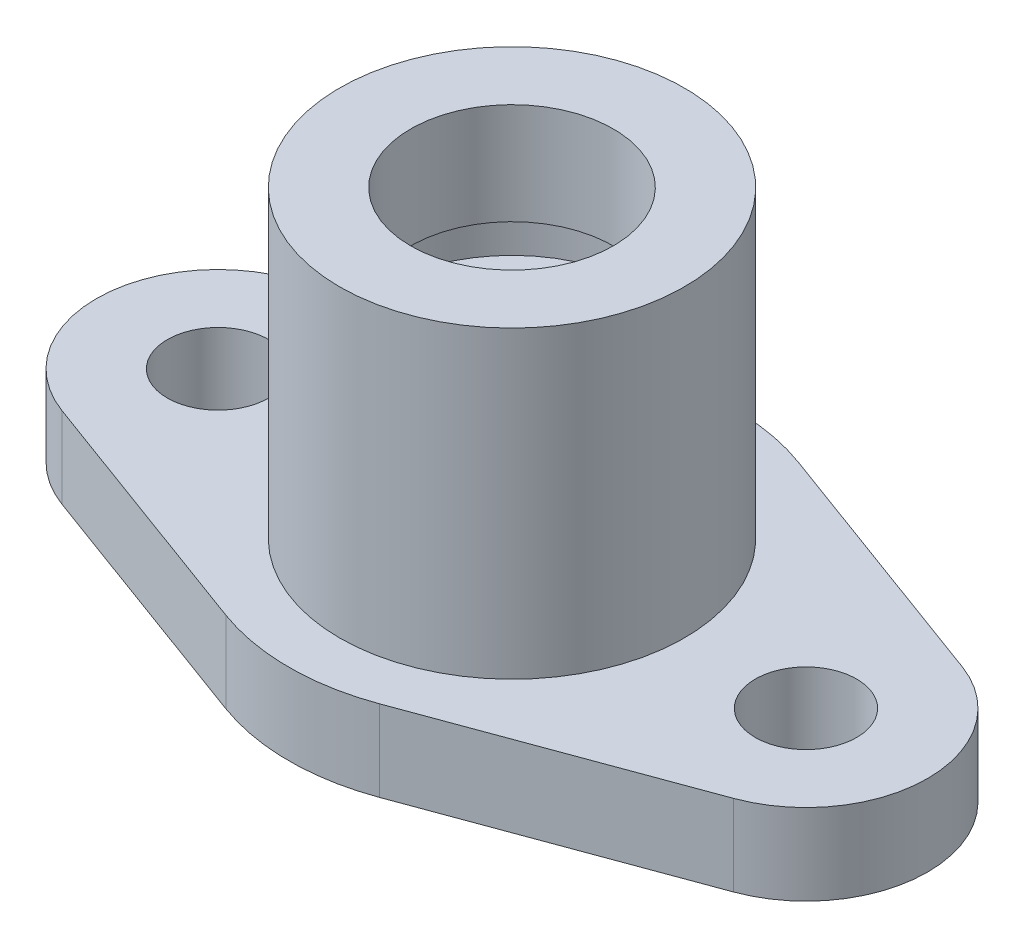
ISO-10303-21;
HEADER;
FILE_DESCRIPTION(('STEP AP214'),'2;1');
FILE_NAME('part.step','',(''),(''),'','','');
FILE_SCHEMA(('AUTOMOTIVE_DESIGN { 1 0 10303 214 1 1 1 1 }'));
ENDSEC;
DATA;
#1=APPLICATION_CONTEXT('core data for automotive mechanical design processes');
#2=APPLICATION_PROTOCOL_DEFINITION('international standard','automotive_design',2000,#1);
#3=PRODUCT_CONTEXT('',#1,'mechanical');
#4=PRODUCT('Part','Part','',(#3));
#5=PRODUCT_RELATED_PRODUCT_CATEGORY('part','',(#4));
#6=PRODUCT_DEFINITION_FORMATION('','',#4);
#7=PRODUCT_DEFINITION_CONTEXT('part definition',#1,'design');
#8=PRODUCT_DEFINITION('design','',#6,#7);
#9=PRODUCT_DEFINITION_SHAPE('','',#8);
#10=(LENGTH_UNIT() NAMED_UNIT(*) SI_UNIT(.MILLI.,.METRE.));
#11=(NAMED_UNIT(*) PLANE_ANGLE_UNIT() SI_UNIT($,.RADIAN.));
#12=(NAMED_UNIT(*) SI_UNIT($,.STERADIAN.) SOLID_ANGLE_UNIT());
#13=UNCERTAINTY_MEASURE_WITH_UNIT(LENGTH_MEASURE(1.E-05),#10,'distance_accuracy_value','');
#14=(GEOMETRIC_REPRESENTATION_CONTEXT(3) GLOBAL_UNCERTAINTY_ASSIGNED_CONTEXT((#13)) GLOBAL_UNIT_ASSIGNED_CONTEXT((#10,
#11,#12)) REPRESENTATION_CONTEXT('',''));
#15=CARTESIAN_POINT('',(0.,0.,0.));
#16=DIRECTION('',(0.,0.,1.));
#17=DIRECTION('',(1.,0.,0.));
#18=AXIS2_PLACEMENT_3D('',#15,#16,#17);
#19=CARTESIAN_POINT('',(0.,8.,0.));
#20=DIRECTION('',(0.,-1.,0.));
#21=DIRECTION('',(0.,0.,-1.));
#22=AXIS2_PLACEMENT_3D('',#19,#20,#21);
#23=CYLINDRICAL_SURFACE('',#22,10.);
#24=CARTESIAN_POINT('',(0.,23.,0.));
#25=DIRECTION('',(0.,-1.,0.));
#26=DIRECTION('',(0.,0.,-1.));
#27=AXIS2_PLACEMENT_3D('',#24,#25,#26);
#28=CIRCLE('',#27,10.);
#29=CARTESIAN_POINT('',(0.,23.,-10.));
#30=VERTEX_POINT('',#29);
#31=EDGE_CURVE('E34',#30,#30,#28,.T.);
#32=ORIENTED_EDGE('',*,*,#31,.F.);
#33=EDGE_LOOP('',(#32));
#34=FACE_BOUND('',#33,.T.);
#35=CARTESIAN_POINT('',(0.,0.,0.));
#36=DIRECTION('',(0.,1.,0.));
#37=DIRECTION('',(0.,0.,1.));
#38=AXIS2_PLACEMENT_3D('',#35,#36,#37);
#39=CIRCLE('',#38,10.);
#40=CARTESIAN_POINT('',(0.,0.,10.));
#41=VERTEX_POINT('',#40);
#42=EDGE_CURVE('E156',#41,#41,#39,.T.);
#43=ORIENTED_EDGE('',*,*,#42,.F.);
#44=EDGE_LOOP('',(#43));
#45=FACE_BOUND('',#44,.T.);
#46=ADVANCED_FACE('F30',(#34,#45),#23,.F.);
#47=CARTESIAN_POINT('',(-72.5244304122305,8.,0.));
#48=DIRECTION('',(0.,1.,0.));
#49=DIRECTION('',(0.,0.,1.));
#50=AXIS2_PLACEMENT_3D('',#47,#48,#49);
#51=PLANE('',#50);
#52=CARTESIAN_POINT('',(-29.,8.,0.));
#53=DIRECTION('',(0.,1.,0.));
#54=DIRECTION('',(0.,0.,1.));
#55=AXIS2_PLACEMENT_3D('',#52,#53,#54);
#56=CIRCLE('',#55,5.);
#57=CARTESIAN_POINT('',(-29.,8.,5.));
#58=VERTEX_POINT('',#57);
#59=EDGE_CURVE('E124',#58,#58,#56,.T.);
#60=ORIENTED_EDGE('',*,*,#59,.F.);
#61=EDGE_LOOP('',(#60));
#62=FACE_BOUND('',#61,.T.);
#63=DIRECTION('',(0.938666040608014,0.,-0.344827586206896));
#64=VECTOR('',#63,1.);
#65=CARTESIAN_POINT('',(-56.3146289363411,8.,44.1252114942038));
#66=LINE('',#65,#64);
#67=CARTESIAN_POINT('',(7.58620689655172,8.,20.6506528933763));
#68=VERTEX_POINT('',#67);
#69=CARTESIAN_POINT('',(33.1379310344827,8.,11.2639924872962));
#70=VERTEX_POINT('',#69);
#71=EDGE_CURVE('E192',#68,#70,#66,.T.);
#72=ORIENTED_EDGE('',*,*,#71,.T.);
#73=CARTESIAN_POINT('',(29.,8.,0.));
#74=DIRECTION('',(0.,1.,0.));
#75=DIRECTION('',(0.,0.,1.));
#76=AXIS2_PLACEMENT_3D('',#73,#74,#75);
#77=CIRCLE('',#76,12.);
#78=CARTESIAN_POINT('',(33.1379310344827,8.,-11.2639924872962));
#79=VERTEX_POINT('',#78);
#80=EDGE_CURVE('E88',#70,#79,#77,.T.);
#81=ORIENTED_EDGE('',*,*,#80,.T.);
#82=DIRECTION('',(0.938666040608014,0.,0.344827586206896));
#83=VECTOR('',#82,1.);
#84=CARTESIAN_POINT('',(-56.3146289363411,8.,-44.1252114942038));
#85=LINE('',#84,#83);
#86=CARTESIAN_POINT('',(7.58620689655173,8.,-20.6506528933763));
#87=VERTEX_POINT('',#86);
#88=EDGE_CURVE('E195',#87,#79,#85,.T.);
#89=ORIENTED_EDGE('',*,*,#88,.F.);
#90=CARTESIAN_POINT('',(0.,8.,0.));
#91=DIRECTION('',(0.,1.,0.));
#92=DIRECTION('',(0.,0.,1.));
#93=AXIS2_PLACEMENT_3D('',#90,#91,#92);
#94=CIRCLE('',#93,22.);
#95=CARTESIAN_POINT('',(-7.58620689655172,8.,-20.6506528933763));
#96=VERTEX_POINT('',#95);
#97=EDGE_CURVE('E126',#87,#96,#94,.T.);
#98=ORIENTED_EDGE('',*,*,#97,.T.);
#99=DIRECTION('',(-0.938666040608014,0.,0.344827586206896));
#100=VECTOR('',#99,1.);
#101=CARTESIAN_POINT('',(-71.4870427294445,8.,2.82390570745123));
#102=LINE('',#101,#100);
#103=CARTESIAN_POINT('',(-33.1379310344828,8.,-11.2639924872962));
#104=VERTEX_POINT('',#103);
#105=EDGE_CURVE('E119',#96,#104,#102,.T.);
#106=ORIENTED_EDGE('',*,*,#105,.T.);
#107=CARTESIAN_POINT('',(-29.,8.,0.));
#108=DIRECTION('',(0.,1.,0.));
#109=DIRECTION('',(0.,0.,1.));
#110=AXIS2_PLACEMENT_3D('',#107,#108,#109);
#111=CIRCLE('',#110,12.);
#112=CARTESIAN_POINT('',(-33.1379310344828,8.,11.2639924872962));
#113=VERTEX_POINT('',#112);
#114=EDGE_CURVE('E106',#113,#104,#111,.F.);
#115=ORIENTED_EDGE('',*,*,#114,.F.);
#116=DIRECTION('',(-0.938666040608014,0.,-0.344827586206896));
#117=VECTOR('',#116,1.);
#118=CARTESIAN_POINT('',(-71.4870427294445,8.,-2.82390570745123));
#119=LINE('',#118,#117);
#120=CARTESIAN_POINT('',(-7.58620689655172,8.,20.6506528933763));
#121=VERTEX_POINT('',#120);
#122=EDGE_CURVE('E117',#121,#113,#119,.T.);
#123=ORIENTED_EDGE('',*,*,#122,.F.);
#124=EDGE_CURVE('E49',#121,#68,#94,.T.);
#125=ORIENTED_EDGE('',*,*,#124,.T.);
#126=EDGE_LOOP('',(#72,#81,#89,#98,#106,#115,#123,#125));
#127=FACE_BOUND('',#126,.T.);
#128=CARTESIAN_POINT('',(29.,8.,0.));
#129=DIRECTION('',(0.,1.,0.));
#130=DIRECTION('',(0.,0.,1.));
#131=AXIS2_PLACEMENT_3D('',#128,#129,#130);
#132=CIRCLE('',#131,5.);
#133=CARTESIAN_POINT('',(29.,8.,5.));
#134=VERTEX_POINT('',#133);
#135=EDGE_CURVE('E159',#134,#134,#132,.T.);
#136=ORIENTED_EDGE('',*,*,#135,.F.);
#137=EDGE_LOOP('',(#136));
#138=FACE_BOUND('',#137,.T.);
#139=CARTESIAN_POINT('',(0.,8.,0.));
#140=DIRECTION('',(0.,1.,0.));
#141=DIRECTION('',(0.,0.,1.));
#142=AXIS2_PLACEMENT_3D('',#139,#140,#141);
#143=CIRCLE('',#142,17.);
#144=CARTESIAN_POINT('',(0.,8.,17.));
#145=VERTEX_POINT('',#144);
#146=EDGE_CURVE('E136',#145,#145,#143,.F.);
#147=ORIENTED_EDGE('',*,*,#146,.T.);
#148=EDGE_LOOP('',(#147));
#149=FACE_BOUND('',#148,.T.);
#150=ADVANCED_FACE('F115',(#62,#127,#138,#149),#51,.T.);
#151=CARTESIAN_POINT('',(-56.3146289363411,8.,44.1252114942038));
#152=DIRECTION('',(-0.344827586206896,0.,-0.938666040608014));
#153=DIRECTION('',(-0.938666040608014,0.,0.344827586206896));
#154=AXIS2_PLACEMENT_3D('',#151,#152,#153);
#155=PLANE('',#154);
#156=DIRECTION('',(0.938666040608014,0.,-0.344827586206896));
#157=VECTOR('',#156,1.);
#158=CARTESIAN_POINT('',(-56.3146289363411,0.,44.1252114942038));
#159=LINE('',#158,#157);
#160=CARTESIAN_POINT('',(7.58620689655172,0.,20.6506528933763));
#161=VERTEX_POINT('',#160);
#162=CARTESIAN_POINT('',(33.1379310344827,0.,11.2639924872962));
#163=VERTEX_POINT('',#162);
#164=EDGE_CURVE('E135',#161,#163,#159,.T.);
#165=ORIENTED_EDGE('',*,*,#164,.T.);
#166=DIRECTION('',(0.,-1.,0.));
#167=VECTOR('',#166,1.);
#168=CARTESIAN_POINT('',(33.1379310344827,8.,11.2639924872962));
#169=LINE('',#168,#167);
#170=EDGE_CURVE('E11',#70,#163,#169,.T.);
#171=ORIENTED_EDGE('',*,*,#170,.F.);
#172=ORIENTED_EDGE('',*,*,#71,.F.);
#173=DIRECTION('',(0.,-1.,0.));
#174=VECTOR('',#173,1.);
#175=CARTESIAN_POINT('',(7.58620689655172,8.,20.6506528933763));
#176=LINE('',#175,#174);
#177=EDGE_CURVE('E131',#68,#161,#176,.T.);
#178=ORIENTED_EDGE('',*,*,#177,.T.);
#179=EDGE_LOOP('',(#165,#171,#172,#178));
#180=FACE_BOUND('',#179,.T.);
#181=ADVANCED_FACE('F212',(#180),#155,.F.);
#182=CARTESIAN_POINT('',(29.,8.,0.));
#183=DIRECTION('',(0.,-1.,0.));
#184=DIRECTION('',(0.,0.,-1.));
#185=AXIS2_PLACEMENT_3D('',#182,#183,#184);
#186=CYLINDRICAL_SURFACE('',#185,12.);
#187=CARTESIAN_POINT('',(29.,0.,0.));
#188=DIRECTION('',(0.,1.,0.));
#189=DIRECTION('',(0.,0.,1.));
#190=AXIS2_PLACEMENT_3D('',#187,#188,#189);
#191=CIRCLE('',#190,12.);
#192=CARTESIAN_POINT('',(33.1379310344827,0.,-11.2639924872962));
#193=VERTEX_POINT('',#192);
#194=EDGE_CURVE('E139',#163,#193,#191,.T.);
#195=ORIENTED_EDGE('',*,*,#194,.T.);
#196=DIRECTION('',(0.,-1.,0.));
#197=VECTOR('',#196,1.);
#198=CARTESIAN_POINT('',(33.1379310344827,8.,-11.2639924872962));
#199=LINE('',#198,#197);
#200=EDGE_CURVE('E40',#79,#193,#199,.T.);
#201=ORIENTED_EDGE('',*,*,#200,.F.);
#202=ORIENTED_EDGE('',*,*,#80,.F.);
#203=ORIENTED_EDGE('',*,*,#170,.T.);
#204=EDGE_LOOP('',(#195,#201,#202,#203));
#205=FACE_BOUND('',#204,.T.);
#206=ADVANCED_FACE('F390',(#205),#186,.T.);
#207=CARTESIAN_POINT('',(-56.3146289363411,8.,-44.1252114942038));
#208=DIRECTION('',(0.344827586206896,0.,-0.938666040608014));
#209=DIRECTION('',(-0.938666040608014,0.,-0.344827586206896));
#210=AXIS2_PLACEMENT_3D('',#207,#208,#209);
#211=PLANE('',#210);
#212=DIRECTION('',(0.938666040608014,0.,0.344827586206896));
#213=VECTOR('',#212,1.);
#214=CARTESIAN_POINT('',(-56.3146289363411,0.,-44.1252114942038));
#215=LINE('',#214,#213);
#216=CARTESIAN_POINT('',(7.58620689655173,0.,-20.6506528933763));
#217=VERTEX_POINT('',#216);
#218=EDGE_CURVE('E142',#217,#193,#215,.T.);
#219=ORIENTED_EDGE('',*,*,#218,.F.);
#220=DIRECTION('',(0.,-1.,0.));
#221=VECTOR('',#220,1.);
#222=CARTESIAN_POINT('',(7.58620689655173,8.,-20.6506528933763));
#223=LINE('',#222,#221);
#224=EDGE_CURVE('E166',#87,#217,#223,.T.);
#225=ORIENTED_EDGE('',*,*,#224,.F.);
#226=ORIENTED_EDGE('',*,*,#88,.T.);
#227=ORIENTED_EDGE('',*,*,#200,.T.);
#228=EDGE_LOOP('',(#219,#225,#226,#227));
#229=FACE_BOUND('',#228,.T.);
#230=ADVANCED_FACE('F228',(#229),#211,.T.);
#231=CARTESIAN_POINT('',(0.,8.,0.));
#232=DIRECTION('',(0.,-1.,0.));
#233=DIRECTION('',(0.,0.,-1.));
#234=AXIS2_PLACEMENT_3D('',#231,#232,#233);
#235=CYLINDRICAL_SURFACE('',#234,22.);
#236=CARTESIAN_POINT('',(0.,0.,0.));
#237=DIRECTION('',(0.,1.,0.));
#238=DIRECTION('',(0.,0.,1.));
#239=AXIS2_PLACEMENT_3D('',#236,#237,#238);
#240=CIRCLE('',#239,22.);
#241=CARTESIAN_POINT('',(-7.58620689655172,0.,-20.6506528933763));
#242=VERTEX_POINT('',#241);
#243=EDGE_CURVE('E145',#217,#242,#240,.T.);
#244=ORIENTED_EDGE('',*,*,#243,.T.);
#245=DIRECTION('',(0.,-1.,0.));
#246=VECTOR('',#245,1.);
#247=CARTESIAN_POINT('',(-7.58620689655172,8.,-20.6506528933763));
#248=LINE('',#247,#246);
#249=EDGE_CURVE('E163',#96,#242,#248,.T.);
#250=ORIENTED_EDGE('',*,*,#249,.F.);
#251=ORIENTED_EDGE('',*,*,#97,.F.);
#252=ORIENTED_EDGE('',*,*,#224,.T.);
#253=EDGE_LOOP('',(#244,#250,#251,#252));
#254=FACE_BOUND('',#253,.T.);
#255=ADVANCED_FACE('F201',(#254),#235,.T.);
#256=CARTESIAN_POINT('',(-71.4870427294445,8.,2.82390570745123));
#257=DIRECTION('',(0.344827586206896,0.,0.938666040608014));
#258=DIRECTION('',(0.938666040608014,0.,-0.344827586206896));
#259=AXIS2_PLACEMENT_3D('',#256,#257,#258);
#260=PLANE('',#259);
#261=DIRECTION('',(-0.938666040608014,0.,0.344827586206896));
#262=VECTOR('',#261,1.);
#263=CARTESIAN_POINT('',(-71.4870427294445,0.,2.82390570745123));
#264=LINE('',#263,#262);
#265=CARTESIAN_POINT('',(-33.1379310344828,0.,-11.2639924872962));
#266=VERTEX_POINT('',#265);
#267=EDGE_CURVE('E147',#242,#266,#264,.T.);
#268=ORIENTED_EDGE('',*,*,#267,.T.);
#269=DIRECTION('',(0.,-1.,0.));
#270=VECTOR('',#269,1.);
#271=CARTESIAN_POINT('',(-33.1379310344828,8.,-11.2639924872962));
#272=LINE('',#271,#270);
#273=EDGE_CURVE('E113',#104,#266,#272,.T.);
#274=ORIENTED_EDGE('',*,*,#273,.F.);
#275=ORIENTED_EDGE('',*,*,#105,.F.);
#276=ORIENTED_EDGE('',*,*,#249,.T.);
#277=EDGE_LOOP('',(#268,#274,#275,#276));
#278=FACE_BOUND('',#277,.T.);
#279=ADVANCED_FACE('F205',(#278),#260,.F.);
#280=CARTESIAN_POINT('',(-29.,8.,0.));
#281=DIRECTION('',(0.,-1.,0.));
#282=DIRECTION('',(0.,0.,-1.));
#283=AXIS2_PLACEMENT_3D('',#280,#281,#282);
#284=CYLINDRICAL_SURFACE('',#283,12.);
#285=CARTESIAN_POINT('',(-29.,0.,0.));
#286=DIRECTION('',(0.,1.,0.));
#287=DIRECTION('',(0.,0.,1.));
#288=AXIS2_PLACEMENT_3D('',#285,#286,#287);
#289=CIRCLE('',#288,12.);
#290=CARTESIAN_POINT('',(-33.1379310344828,0.,11.2639924872962));
#291=VERTEX_POINT('',#290);
#292=EDGE_CURVE('E108',#291,#266,#289,.F.);
#293=ORIENTED_EDGE('',*,*,#292,.F.);
#294=DIRECTION('',(0.,-1.,0.));
#295=VECTOR('',#294,1.);
#296=CARTESIAN_POINT('',(-33.1379310344828,8.,11.2639924872962));
#297=LINE('',#296,#295);
#298=EDGE_CURVE('E103',#113,#291,#297,.T.);
#299=ORIENTED_EDGE('',*,*,#298,.F.);
#300=ORIENTED_EDGE('',*,*,#114,.T.);
#301=ORIENTED_EDGE('',*,*,#273,.T.);
#302=EDGE_LOOP('',(#293,#299,#300,#301));
#303=FACE_BOUND('',#302,.T.);
#304=ADVANCED_FACE('F105',(#303),#284,.T.);
#305=CARTESIAN_POINT('',(-71.4870427294445,8.,-2.82390570745123));
#306=DIRECTION('',(-0.344827586206896,0.,0.938666040608014));
#307=DIRECTION('',(0.938666040608014,0.,0.344827586206896));
#308=AXIS2_PLACEMENT_3D('',#305,#306,#307);
#309=PLANE('',#308);
#310=DIRECTION('',(-0.938666040608014,0.,-0.344827586206896));
#311=VECTOR('',#310,1.);
#312=CARTESIAN_POINT('',(-71.4870427294445,0.,-2.82390570745123));
#313=LINE('',#312,#311);
#314=CARTESIAN_POINT('',(-7.58620689655172,0.,20.6506528933763));
#315=VERTEX_POINT('',#314);
#316=EDGE_CURVE('E151',#315,#291,#313,.T.);
#317=ORIENTED_EDGE('',*,*,#316,.F.);
#318=DIRECTION('',(0.,-1.,0.));
#319=VECTOR('',#318,1.);
#320=CARTESIAN_POINT('',(-7.58620689655172,8.,20.6506528933763));
#321=LINE('',#320,#319);
#322=EDGE_CURVE('E77',#121,#315,#321,.T.);
#323=ORIENTED_EDGE('',*,*,#322,.F.);
#324=ORIENTED_EDGE('',*,*,#122,.T.);
#325=ORIENTED_EDGE('',*,*,#298,.T.);
#326=EDGE_LOOP('',(#317,#323,#324,#325));
#327=FACE_BOUND('',#326,.T.);
#328=ADVANCED_FACE('F122',(#327),#309,.T.);
#329=CARTESIAN_POINT('',(-29.,8.,0.));
#330=DIRECTION('',(0.,-1.,0.));
#331=DIRECTION('',(0.,0.,-1.));
#332=AXIS2_PLACEMENT_3D('',#329,#330,#331);
#333=CYLINDRICAL_SURFACE('',#332,5.);
#334=ORIENTED_EDGE('',*,*,#59,.T.);
#335=EDGE_LOOP('',(#334));
#336=FACE_BOUND('',#335,.T.);
#337=CARTESIAN_POINT('',(-29.,0.,0.));
#338=DIRECTION('',(0.,1.,0.));
#339=DIRECTION('',(0.,0.,1.));
#340=AXIS2_PLACEMENT_3D('',#337,#338,#339);
#341=CIRCLE('',#340,5.);
#342=CARTESIAN_POINT('',(-29.,0.,5.));
#343=VERTEX_POINT('',#342);
#344=EDGE_CURVE('E153',#343,#343,#341,.T.);
#345=ORIENTED_EDGE('',*,*,#344,.F.);
#346=EDGE_LOOP('',(#345));
#347=FACE_BOUND('',#346,.T.);
#348=ADVANCED_FACE('F216',(#336,#347),#333,.F.);
#349=EDGE_CURVE('E80',#315,#161,#240,.T.);
#350=ORIENTED_EDGE('',*,*,#349,.T.);
#351=ORIENTED_EDGE('',*,*,#177,.F.);
#352=ORIENTED_EDGE('',*,*,#124,.F.);
#353=ORIENTED_EDGE('',*,*,#322,.T.);
#354=EDGE_LOOP('',(#350,#351,#352,#353));
#355=FACE_BOUND('',#354,.T.);
#356=ADVANCED_FACE('F214',(#355),#235,.T.);
#357=CARTESIAN_POINT('',(29.,8.,0.));
#358=DIRECTION('',(0.,-1.,0.));
#359=DIRECTION('',(0.,0.,-1.));
#360=AXIS2_PLACEMENT_3D('',#357,#358,#359);
#361=CYLINDRICAL_SURFACE('',#360,5.);
#362=ORIENTED_EDGE('',*,*,#135,.T.);
#363=EDGE_LOOP('',(#362));
#364=FACE_BOUND('',#363,.T.);
#365=CARTESIAN_POINT('',(29.,0.,0.));
#366=DIRECTION('',(0.,1.,0.));
#367=DIRECTION('',(0.,0.,1.));
#368=AXIS2_PLACEMENT_3D('',#365,#366,#367);
#369=CIRCLE('',#368,5.);
#370=CARTESIAN_POINT('',(29.,0.,5.));
#371=VERTEX_POINT('',#370);
#372=EDGE_CURVE('E132',#371,#371,#369,.T.);
#373=ORIENTED_EDGE('',*,*,#372,.F.);
#374=EDGE_LOOP('',(#373));
#375=FACE_BOUND('',#374,.T.);
#376=ADVANCED_FACE('F32',(#364,#375),#361,.F.);
#377=CARTESIAN_POINT('',(0.,28.,0.));
#378=DIRECTION('',(0.,1.,0.));
#379=DIRECTION('',(0.,0.,1.));
#380=AXIS2_PLACEMENT_3D('',#377,#378,#379);
#381=CIRCLE('',#380,10.);
#382=CARTESIAN_POINT('',(0.,28.,10.));
#383=VERTEX_POINT('',#382);
#384=EDGE_CURVE('E168',#383,#383,#381,.T.);
#385=ORIENTED_EDGE('',*,*,#384,.F.);
#386=EDGE_LOOP('',(#385));
#387=FACE_BOUND('',#386,.T.);
#388=CARTESIAN_POINT('',(0.,38.,0.));
#389=DIRECTION('',(0.,1.,0.));
#390=DIRECTION('',(0.,0.,1.));
#391=AXIS2_PLACEMENT_3D('',#388,#389,#390);
#392=CIRCLE('',#391,10.);
#393=CARTESIAN_POINT('',(0.,38.,10.));
#394=VERTEX_POINT('',#393);
#395=EDGE_CURVE('E174',#394,#394,#392,.T.);
#396=ORIENTED_EDGE('',*,*,#395,.T.);
#397=EDGE_LOOP('',(#396));
#398=FACE_BOUND('',#397,.T.);
#399=ADVANCED_FACE('F222',(#387,#398),#23,.F.);
#400=CARTESIAN_POINT('',(-72.5244304122305,0.,0.));
#401=DIRECTION('',(0.,1.,0.));
#402=DIRECTION('',(0.,0.,1.));
#403=AXIS2_PLACEMENT_3D('',#400,#401,#402);
#404=PLANE('',#403);
#405=ORIENTED_EDGE('',*,*,#42,.T.);
#406=EDGE_LOOP('',(#405));
#407=FACE_BOUND('',#406,.T.);
#408=ORIENTED_EDGE('',*,*,#344,.T.);
#409=EDGE_LOOP('',(#408));
#410=FACE_BOUND('',#409,.T.);
#411=ORIENTED_EDGE('',*,*,#164,.F.);
#412=ORIENTED_EDGE('',*,*,#349,.F.);
#413=ORIENTED_EDGE('',*,*,#316,.T.);
#414=ORIENTED_EDGE('',*,*,#292,.T.);
#415=ORIENTED_EDGE('',*,*,#267,.F.);
#416=ORIENTED_EDGE('',*,*,#243,.F.);
#417=ORIENTED_EDGE('',*,*,#218,.T.);
#418=ORIENTED_EDGE('',*,*,#194,.F.);
#419=EDGE_LOOP('',(#411,#412,#413,#414,#415,#416,#417,#418));
#420=FACE_BOUND('',#419,.T.);
#421=ORIENTED_EDGE('',*,*,#372,.T.);
#422=EDGE_LOOP('',(#421));
#423=FACE_BOUND('',#422,.T.);
#424=ADVANCED_FACE('F208',(#407,#410,#420,#423),#404,.F.);
#425=CARTESIAN_POINT('',(0.,38.,0.));
#426=DIRECTION('',(0.,-1.,0.));
#427=DIRECTION('',(0.,0.,-1.));
#428=AXIS2_PLACEMENT_3D('',#425,#426,#427);
#429=CYLINDRICAL_SURFACE('',#428,17.);
#430=ORIENTED_EDGE('',*,*,#146,.F.);
#431=EDGE_LOOP('',(#430));
#432=FACE_BOUND('',#431,.T.);
#433=CARTESIAN_POINT('',(0.,38.,0.));
#434=DIRECTION('',(0.,1.,0.));
#435=DIRECTION('',(0.,0.,1.));
#436=AXIS2_PLACEMENT_3D('',#433,#434,#435);
#437=CIRCLE('',#436,17.);
#438=CARTESIAN_POINT('',(0.,38.,17.));
#439=VERTEX_POINT('',#438);
#440=EDGE_CURVE('E185',#439,#439,#437,.T.);
#441=ORIENTED_EDGE('',*,*,#440,.F.);
#442=EDGE_LOOP('',(#441));
#443=FACE_BOUND('',#442,.T.);
#444=ADVANCED_FACE('F245',(#432,#443),#429,.T.);
#445=CARTESIAN_POINT('',(-72.5244304122305,38.,0.));
#446=DIRECTION('',(0.,1.,0.));
#447=DIRECTION('',(0.,0.,1.));
#448=AXIS2_PLACEMENT_3D('',#445,#446,#447);
#449=PLANE('',#448);
#450=ORIENTED_EDGE('',*,*,#395,.F.);
#451=EDGE_LOOP('',(#450));
#452=FACE_BOUND('',#451,.T.);
#453=ORIENTED_EDGE('',*,*,#440,.T.);
#454=EDGE_LOOP('',(#453));
#455=FACE_BOUND('',#454,.T.);
#456=ADVANCED_FACE('F250',(#452,#455),#449,.T.);
#457=CARTESIAN_POINT('',(0.,23.,0.));
#458=DIRECTION('',(0.,-1.,0.));
#459=DIRECTION('',(0.,0.,-1.));
#460=AXIS2_PLACEMENT_3D('',#457,#458,#459);
#461=PLANE('',#460);
#462=ORIENTED_EDGE('',*,*,#31,.T.);
#463=EDGE_LOOP('',(#462));
#464=FACE_BOUND('',#463,.T.);
#465=CARTESIAN_POINT('',(0.,23.,0.));
#466=DIRECTION('',(0.,-1.,0.));
#467=DIRECTION('',(0.,0.,-1.));
#468=AXIS2_PLACEMENT_3D('',#465,#466,#467);
#469=CIRCLE('',#468,13.);
#470=CARTESIAN_POINT('',(0.,23.,-13.));
#471=VERTEX_POINT('',#470);
#472=EDGE_CURVE('E170',#471,#471,#469,.T.);
#473=ORIENTED_EDGE('',*,*,#472,.F.);
#474=EDGE_LOOP('',(#473));
#475=FACE_BOUND('',#474,.T.);
#476=ADVANCED_FACE('F253',(#464,#475),#461,.F.);
#477=CARTESIAN_POINT('',(0.,0.,0.));
#478=DIRECTION('',(0.,-1.,0.));
#479=DIRECTION('',(0.,0.,-1.));
#480=AXIS2_PLACEMENT_3D('',#477,#478,#479);
#481=CYLINDRICAL_SURFACE('',#480,13.);
#482=CARTESIAN_POINT('',(0.,28.,0.));
#483=DIRECTION('',(0.,-1.,0.));
#484=DIRECTION('',(0.,0.,-1.));
#485=AXIS2_PLACEMENT_3D('',#482,#483,#484);
#486=CIRCLE('',#485,13.);
#487=CARTESIAN_POINT('',(0.,28.,-13.));
#488=VERTEX_POINT('',#487);
#489=EDGE_CURVE('E176',#488,#488,#486,.T.);
#490=ORIENTED_EDGE('',*,*,#489,.F.);
#491=EDGE_LOOP('',(#490));
#492=FACE_BOUND('',#491,.T.);
#493=ORIENTED_EDGE('',*,*,#472,.T.);
#494=EDGE_LOOP('',(#493));
#495=FACE_BOUND('',#494,.T.);
#496=ADVANCED_FACE('F266',(#492,#495),#481,.F.);
#497=CARTESIAN_POINT('',(0.,28.,0.));
#498=DIRECTION('',(0.,1.,0.));
#499=DIRECTION('',(0.,0.,1.));
#500=AXIS2_PLACEMENT_3D('',#497,#498,#499);
#501=PLANE('',#500);
#502=ORIENTED_EDGE('',*,*,#384,.T.);
#503=EDGE_LOOP('',(#502));
#504=FACE_BOUND('',#503,.T.);
#505=ORIENTED_EDGE('',*,*,#489,.T.);
#506=EDGE_LOOP('',(#505));
#507=FACE_BOUND('',#506,.T.);
#508=ADVANCED_FACE('F270',(#504,#507),#501,.F.);
#509=CLOSED_SHELL('',(#46,#150,#181,#206,#230,#255,#279,#304,#328,#348,#356,#376,#399,#424,#444,
#456,#476,#496,#508));
#510=MANIFOLD_SOLID_BREP('B2',#509);
#511=ADVANCED_BREP_SHAPE_REPRESENTATION('',(#18,#510),#14);
#512=SHAPE_DEFINITION_REPRESENTATION(#9,#511);
ENDSEC;
END-ISO-10303-21;
